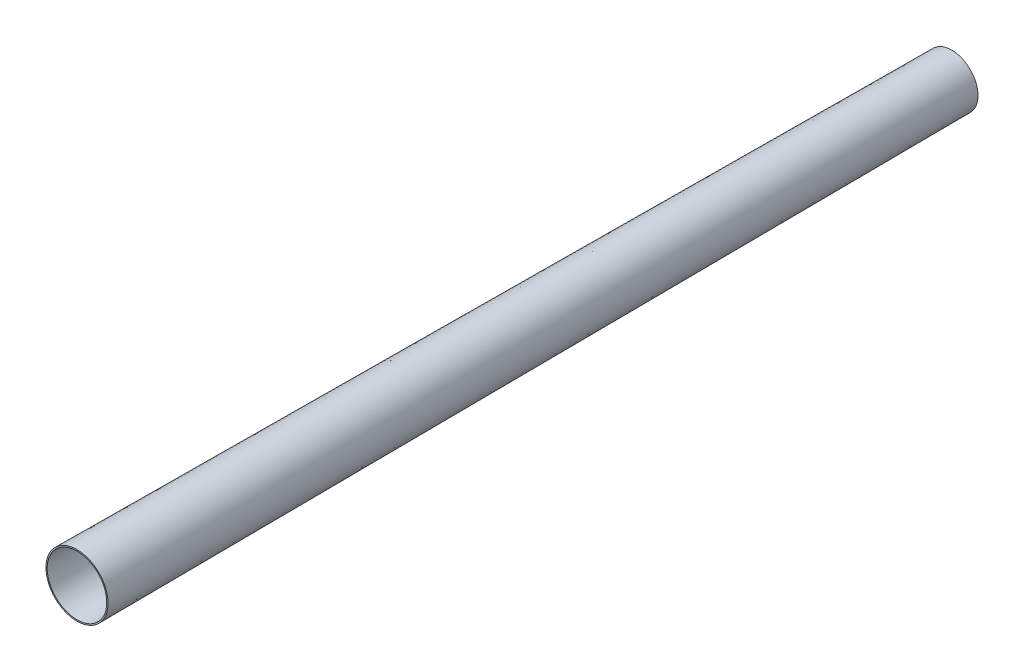
ISO-10303-21;
HEADER;
FILE_DESCRIPTION(('STEP AP214'),'2;1');
FILE_NAME('part.step','',(''),(''),'','','');
FILE_SCHEMA(('AUTOMOTIVE_DESIGN { 1 0 10303 214 1 1 1 1 }'));
ENDSEC;
DATA;
#1=APPLICATION_CONTEXT('core data for automotive mechanical design processes');
#2=APPLICATION_PROTOCOL_DEFINITION('international standard','automotive_design',2000,#1);
#3=PRODUCT_CONTEXT('',#1,'mechanical');
#4=PRODUCT('Part','Part','',(#3));
#5=PRODUCT_RELATED_PRODUCT_CATEGORY('part','',(#4));
#6=PRODUCT_DEFINITION_FORMATION('','',#4);
#7=PRODUCT_DEFINITION_CONTEXT('part definition',#1,'design');
#8=PRODUCT_DEFINITION('design','',#6,#7);
#9=PRODUCT_DEFINITION_SHAPE('','',#8);
#10=(LENGTH_UNIT() NAMED_UNIT(*) SI_UNIT(.MILLI.,.METRE.));
#11=(NAMED_UNIT(*) PLANE_ANGLE_UNIT() SI_UNIT($,.RADIAN.));
#12=(NAMED_UNIT(*) SI_UNIT($,.STERADIAN.) SOLID_ANGLE_UNIT());
#13=UNCERTAINTY_MEASURE_WITH_UNIT(LENGTH_MEASURE(1.E-05),#10,'distance_accuracy_value','');
#14=(GEOMETRIC_REPRESENTATION_CONTEXT(3) GLOBAL_UNCERTAINTY_ASSIGNED_CONTEXT((#13)) GLOBAL_UNIT_ASSIGNED_CONTEXT((#10,
#11,#12)) REPRESENTATION_CONTEXT('',''));
#15=CARTESIAN_POINT('',(0.,0.,0.));
#16=DIRECTION('',(0.,0.,1.));
#17=DIRECTION('',(1.,0.,0.));
#18=AXIS2_PLACEMENT_3D('',#15,#16,#17);
#19=CARTESIAN_POINT('',(0.,0.,349.70022741));
#20=DIRECTION('',(0.,0.,1.));
#21=DIRECTION('',(1.,0.,0.));
#22=AXIS2_PLACEMENT_3D('',#19,#20,#21);
#23=PLANE('',#22);
#24=CARTESIAN_POINT('',(0.,0.,349.70022741));
#25=DIRECTION('',(0.,0.,1.));
#26=DIRECTION('',(1.,0.,0.));
#27=AXIS2_PLACEMENT_3D('',#24,#25,#26);
#28=CIRCLE('',#27,11.9043754058323);
#29=CARTESIAN_POINT('',(11.9043754058323,0.,349.70022741));
#30=VERTEX_POINT('',#29);
#31=EDGE_CURVE('E49',#30,#30,#28,.T.);
#32=ORIENTED_EDGE('',*,*,#31,.F.);
#33=EDGE_LOOP('',(#32));
#34=FACE_BOUND('',#33,.T.);
#35=CARTESIAN_POINT('',(0.,0.,349.70022741));
#36=DIRECTION('',(0.,0.,1.));
#37=DIRECTION('',(1.,0.,0.));
#38=AXIS2_PLACEMENT_3D('',#35,#36,#37);
#39=CIRCLE('',#38,12.4043828819516);
#40=CARTESIAN_POINT('',(12.4043828819516,0.,349.70022741));
#41=VERTEX_POINT('',#40);
#42=EDGE_CURVE('E11',#41,#41,#39,.T.);
#43=ORIENTED_EDGE('',*,*,#42,.T.);
#44=EDGE_LOOP('',(#43));
#45=FACE_BOUND('',#44,.T.);
#46=ADVANCED_FACE('F36',(#34,#45),#23,.T.);
#47=CARTESIAN_POINT('',(0.,0.,0.));
#48=DIRECTION('',(0.,0.,1.));
#49=DIRECTION('',(1.,0.,0.));
#50=AXIS2_PLACEMENT_3D('',#47,#48,#49);
#51=PLANE('',#50);
#52=CARTESIAN_POINT('',(0.,0.,0.));
#53=DIRECTION('',(0.,0.,1.));
#54=DIRECTION('',(1.,0.,0.));
#55=AXIS2_PLACEMENT_3D('',#52,#53,#54);
#56=CIRCLE('',#55,9.99203304486478);
#57=CARTESIAN_POINT('',(9.99203304486478,0.,0.));
#58=VERTEX_POINT('',#57);
#59=EDGE_CURVE('E105',#58,#58,#56,.T.);
#60=ORIENTED_EDGE('',*,*,#59,.T.);
#61=EDGE_LOOP('',(#60));
#62=FACE_BOUND('',#61,.T.);
#63=CARTESIAN_POINT('',(0.,0.,0.));
#64=DIRECTION('',(0.,0.,1.));
#65=DIRECTION('',(1.,0.,0.));
#66=AXIS2_PLACEMENT_3D('',#63,#64,#65);
#67=CIRCLE('',#66,10.4920405209841);
#68=CARTESIAN_POINT('',(10.4920405209841,0.,0.));
#69=VERTEX_POINT('',#68);
#70=EDGE_CURVE('E44',#69,#69,#67,.T.);
#71=ORIENTED_EDGE('',*,*,#70,.F.);
#72=EDGE_LOOP('',(#71));
#73=FACE_BOUND('',#72,.T.);
#74=ADVANCED_FACE('F68',(#62,#73),#51,.F.);
#75=CARTESIAN_POINT('',(0.,0.,0.));
#76=DIRECTION('',(0.,0.,1.));
#77=DIRECTION('',(1.,0.,0.));
#78=AXIS2_PLACEMENT_3D('',#75,#76,#77);
#79=CONICAL_SURFACE('',#78,10.4920405209841,0.00546846455547809);
#80=ORIENTED_EDGE('',*,*,#70,.T.);
#81=EDGE_LOOP('',(#80));
#82=FACE_BOUND('',#81,.T.);
#83=ORIENTED_EDGE('',*,*,#42,.F.);
#84=EDGE_LOOP('',(#83));
#85=FACE_BOUND('',#84,.T.);
#86=ADVANCED_FACE('F77',(#82,#85),#79,.T.);
#87=CARTESIAN_POINT('',(0.,0.,0.00273421865029808));
#88=DIRECTION('',(0.,0.,1.));
#89=DIRECTION('',(1.,0.,0.));
#90=AXIS2_PLACEMENT_3D('',#87,#88,#89);
#91=CONICAL_SURFACE('',#90,9.9920479969916,0.00546846455547809);
#92=ORIENTED_EDGE('',*,*,#59,.F.);
#93=EDGE_LOOP('',(#92));
#94=FACE_BOUND('',#93,.T.);
#95=ORIENTED_EDGE('',*,*,#31,.T.);
#96=EDGE_LOOP('',(#95));
#97=FACE_BOUND('',#96,.T.);
#98=ADVANCED_FACE('F79',(#94,#97),#91,.F.);
#99=CLOSED_SHELL('',(#46,#74,#86,#98));
#100=MANIFOLD_SOLID_BREP('B2',#99);
#101=ADVANCED_BREP_SHAPE_REPRESENTATION('',(#18,#100),#14);
#102=SHAPE_DEFINITION_REPRESENTATION(#9,#101);
ENDSEC;
END-ISO-10303-21;
